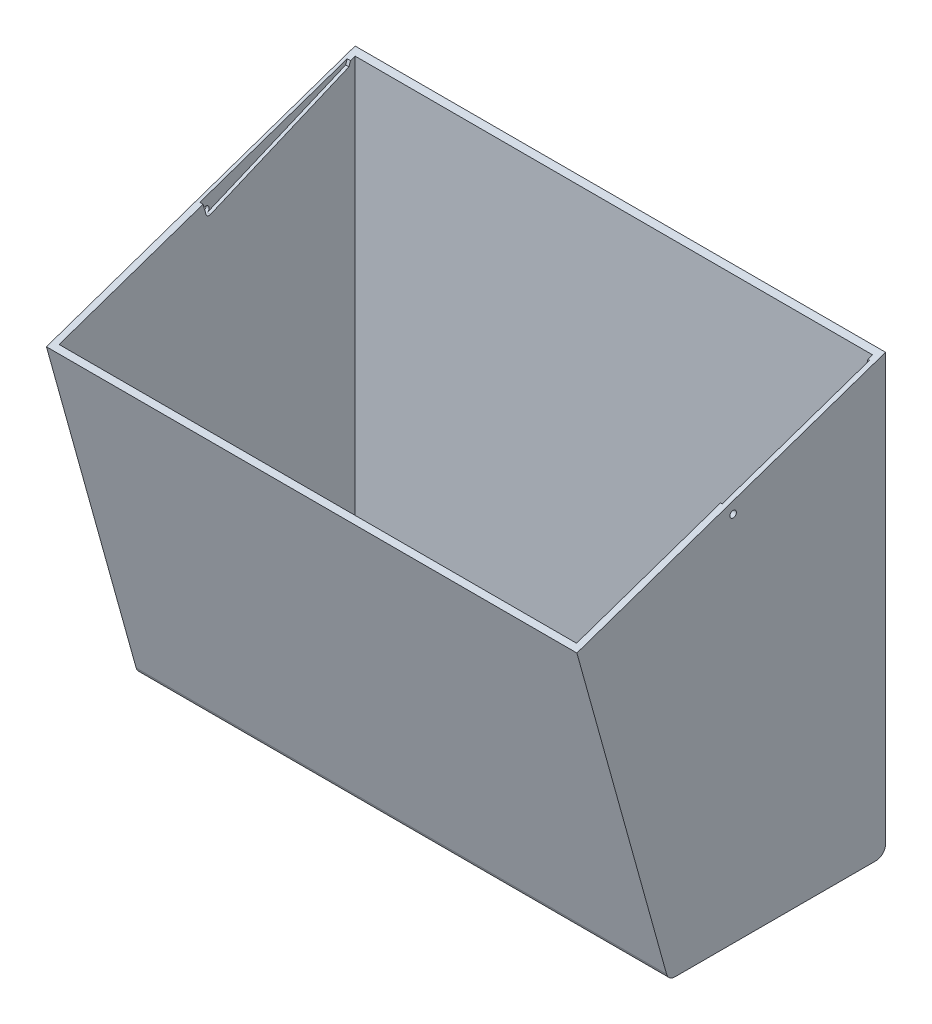
ISO-10303-21;
HEADER;
FILE_DESCRIPTION(('STEP AP214'),'2;1');
FILE_NAME('part.step','',(''),(''),'','','');
FILE_SCHEMA(('AUTOMOTIVE_DESIGN { 1 0 10303 214 1 1 1 1 }'));
ENDSEC;
DATA;
#1=APPLICATION_CONTEXT('core data for automotive mechanical design processes');
#2=APPLICATION_PROTOCOL_DEFINITION('international standard','automotive_design',2000,#1);
#3=PRODUCT_CONTEXT('',#1,'mechanical');
#4=PRODUCT('Part','Part','',(#3));
#5=PRODUCT_RELATED_PRODUCT_CATEGORY('part','',(#4));
#6=PRODUCT_DEFINITION_FORMATION('','',#4);
#7=PRODUCT_DEFINITION_CONTEXT('part definition',#1,'design');
#8=PRODUCT_DEFINITION('design','',#6,#7);
#9=PRODUCT_DEFINITION_SHAPE('','',#8);
#10=(LENGTH_UNIT() NAMED_UNIT(*) SI_UNIT(.MILLI.,.METRE.));
#11=(NAMED_UNIT(*) PLANE_ANGLE_UNIT() SI_UNIT($,.RADIAN.));
#12=(NAMED_UNIT(*) SI_UNIT($,.STERADIAN.) SOLID_ANGLE_UNIT());
#13=UNCERTAINTY_MEASURE_WITH_UNIT(LENGTH_MEASURE(1.E-05),#10,'distance_accuracy_value','');
#14=(GEOMETRIC_REPRESENTATION_CONTEXT(3) GLOBAL_UNCERTAINTY_ASSIGNED_CONTEXT((#13)) GLOBAL_UNIT_ASSIGNED_CONTEXT((#10,
#11,#12)) REPRESENTATION_CONTEXT('',''));
#15=CARTESIAN_POINT('',(0.,0.,0.));
#16=DIRECTION('',(0.,0.,1.));
#17=DIRECTION('',(1.,0.,0.));
#18=AXIS2_PLACEMENT_3D('',#15,#16,#17);
#19=CARTESIAN_POINT('',(330.,-318.691488077077,-100.9));
#20=DIRECTION('',(-1.,0.,0.));
#21=DIRECTION('',(0.,0.,1.));
#22=AXIS2_PLACEMENT_3D('',#19,#20,#21);
#23=PLANE('',#22);
#24=CARTESIAN_POINT('',(330.,-207.504674888679,-57.0650856356226));
#25=DIRECTION('',(-1.,0.,0.));
#26=DIRECTION('',(0.,0.,1.));
#27=AXIS2_PLACEMENT_3D('',#24,#25,#26);
#28=CIRCLE('',#27,0.999999999999998);
#29=CARTESIAN_POINT('',(330.,-207.504674888679,-56.0650856356226));
#30=VERTEX_POINT('',#29);
#31=EDGE_CURVE('E280',#30,#30,#28,.T.);
#32=ORIENTED_EDGE('',*,*,#31,.T.);
#33=EDGE_LOOP('',(#32));
#34=FACE_BOUND('',#33,.T.);
#35=DIRECTION('',(0.,0.325131691734762,-0.94566874910282));
#36=VECTOR('',#35,1.);
#37=CARTESIAN_POINT('',(330.,-220.434086745502,-9.04989839892832));
#38=LINE('',#37,#36);
#39=CARTESIAN_POINT('',(330.,-220.434086745502,-9.04989839892832));
#40=VERTEX_POINT('',#39);
#41=CARTESIAN_POINT('',(330.,-187.823541008395,-103.9));
#42=VERTEX_POINT('',#41);
#43=EDGE_CURVE('E349',#40,#42,#38,.T.);
#44=ORIENTED_EDGE('',*,*,#43,.F.);
#45=DIRECTION('',(0.,0.963531978673682,0.267593210065538));
#46=VECTOR('',#45,1.);
#47=CARTESIAN_POINT('',(330.,-319.713989744254,-36.6220273229737));
#48=LINE('',#47,#46);
#49=CARTESIAN_POINT('',(330.,-319.713989744254,-36.6220273229737));
#50=VERTEX_POINT('',#49);
#51=EDGE_CURVE('E388',#50,#40,#48,.T.);
#52=ORIENTED_EDGE('',*,*,#51,.F.);
#53=CARTESIAN_POINT('',(330.,-318.991488077077,-39.2235636653927));
#54=DIRECTION('',(-1.,0.,0.));
#55=DIRECTION('',(0.,0.,1.));
#56=AXIS2_PLACEMENT_3D('',#53,#54,#55);
#57=CIRCLE('',#56,2.69999999999998);
#58=CARTESIAN_POINT('',(330.,-321.691488077077,-39.2235636653926));
#59=VERTEX_POINT('',#58);
#60=EDGE_CURVE('E384',#59,#50,#57,.T.);
#61=ORIENTED_EDGE('',*,*,#60,.F.);
#62=DIRECTION('',(0.,0.,1.));
#63=VECTOR('',#62,1.);
#64=CARTESIAN_POINT('',(330.,-321.691488077077,-100.9));
#65=LINE('',#64,#63);
#66=CARTESIAN_POINT('',(330.,-321.691488077077,-100.9));
#67=VERTEX_POINT('',#66);
#68=EDGE_CURVE('E380',#67,#59,#65,.T.);
#69=ORIENTED_EDGE('',*,*,#68,.F.);
#70=CARTESIAN_POINT('',(330.,-318.691488077077,-100.9));
#71=DIRECTION('',(-1.,0.,0.));
#72=DIRECTION('',(0.,0.,1.));
#73=AXIS2_PLACEMENT_3D('',#70,#71,#72);
#74=CIRCLE('',#73,3.);
#75=CARTESIAN_POINT('',(330.,-318.691488077077,-103.9));
#76=VERTEX_POINT('',#75);
#77=EDGE_CURVE('E376',#76,#67,#74,.T.);
#78=ORIENTED_EDGE('',*,*,#77,.F.);
#79=DIRECTION('',(0.,-1.,0.));
#80=VECTOR('',#79,1.);
#81=CARTESIAN_POINT('',(330.,-187.823541008395,-103.9));
#82=LINE('',#81,#80);
#83=EDGE_CURVE('E372',#42,#76,#82,.T.);
#84=ORIENTED_EDGE('',*,*,#83,.F.);
#85=EDGE_LOOP('',(#44,#52,#61,#69,#78,#84));
#86=FACE_BOUND('',#85,.T.);
#87=ADVANCED_FACE('F39',(#34,#86),#23,.F.);
#88=CARTESIAN_POINT('',(2.43547298054586,-319.713989744254,-36.6220273229737));
#89=DIRECTION('',(0.,0.267593210065538,-0.963531978673682));
#90=DIRECTION('',(0.,0.963531978673682,0.267593210065538));
#91=AXIS2_PLACEMENT_3D('',#88,#89,#90);
#92=PLANE('',#91);
#93=DIRECTION('',(1.,0.,0.));
#94=VECTOR('',#93,1.);
#95=CARTESIAN_POINT('',(2.43547298054586,-220.434086745502,-9.04989839892832));
#96=LINE('',#95,#94);
#97=CARTESIAN_POINT('',(167.,-220.434086745502,-9.04989839892832));
#98=VERTEX_POINT('',#97);
#99=EDGE_CURVE('E392',#98,#40,#96,.T.);
#100=ORIENTED_EDGE('',*,*,#99,.F.);
#101=DIRECTION('',(0.,-0.963531978673682,-0.267593210065538));
#102=VECTOR('',#101,1.);
#103=CARTESIAN_POINT('',(167.,-319.713989744254,-36.6220273229737));
#104=LINE('',#103,#102);
#105=CARTESIAN_POINT('',(167.,-319.713989744254,-36.6220273229737));
#106=VERTEX_POINT('',#105);
#107=EDGE_CURVE('E358',#98,#106,#104,.T.);
#108=ORIENTED_EDGE('',*,*,#107,.T.);
#109=DIRECTION('',(1.,0.,0.));
#110=VECTOR('',#109,1.);
#111=CARTESIAN_POINT('',(2.43547298054586,-319.713989744254,-36.6220273229737));
#112=LINE('',#111,#110);
#113=EDGE_CURVE('E395',#106,#50,#112,.T.);
#114=ORIENTED_EDGE('',*,*,#113,.T.);
#115=ORIENTED_EDGE('',*,*,#51,.T.);
#116=EDGE_LOOP('',(#100,#108,#114,#115));
#117=FACE_BOUND('',#116,.T.);
#118=ADVANCED_FACE('F414',(#117),#92,.F.);
#119=CARTESIAN_POINT('',(2.43547298054586,-318.991488077077,-39.2235636653927));
#120=DIRECTION('',(1.,0.,0.));
#121=DIRECTION('',(0.,0.,-1.));
#122=AXIS2_PLACEMENT_3D('',#119,#120,#121);
#123=CYLINDRICAL_SURFACE('',#122,2.69999999999998);
#124=ORIENTED_EDGE('',*,*,#113,.F.);
#125=CARTESIAN_POINT('',(167.,-318.991488077077,-39.2235636653927));
#126=DIRECTION('',(1.,0.,0.));
#127=DIRECTION('',(0.,0.,-1.));
#128=AXIS2_PLACEMENT_3D('',#125,#126,#127);
#129=CIRCLE('',#128,2.69999999999998);
#130=CARTESIAN_POINT('',(167.,-321.691488077077,-39.2235636653926));
#131=VERTEX_POINT('',#130);
#132=EDGE_CURVE('E353',#106,#131,#129,.T.);
#133=ORIENTED_EDGE('',*,*,#132,.T.);
#134=DIRECTION('',(1.,0.,0.));
#135=VECTOR('',#134,1.);
#136=CARTESIAN_POINT('',(2.43547298054586,-321.691488077077,-39.2235636653926));
#137=LINE('',#136,#135);
#138=EDGE_CURVE('E398',#131,#59,#137,.T.);
#139=ORIENTED_EDGE('',*,*,#138,.T.);
#140=ORIENTED_EDGE('',*,*,#60,.T.);
#141=EDGE_LOOP('',(#124,#133,#139,#140));
#142=FACE_BOUND('',#141,.T.);
#143=ADVANCED_FACE('F434',(#142),#123,.T.);
#144=CARTESIAN_POINT('',(2.43547298054586,-321.691488077077,-100.9));
#145=DIRECTION('',(0.,1.,0.));
#146=DIRECTION('',(0.,0.,1.));
#147=AXIS2_PLACEMENT_3D('',#144,#145,#146);
#148=PLANE('',#147);
#149=ORIENTED_EDGE('',*,*,#138,.F.);
#150=DIRECTION('',(0.,0.,-1.));
#151=VECTOR('',#150,1.);
#152=CARTESIAN_POINT('',(167.,-321.691488077077,-100.9));
#153=LINE('',#152,#151);
#154=CARTESIAN_POINT('',(167.,-321.691488077077,-100.9));
#155=VERTEX_POINT('',#154);
#156=EDGE_CURVE('E357',#131,#155,#153,.T.);
#157=ORIENTED_EDGE('',*,*,#156,.T.);
#158=DIRECTION('',(1.,0.,0.));
#159=VECTOR('',#158,1.);
#160=CARTESIAN_POINT('',(2.43547298054586,-321.691488077077,-100.9));
#161=LINE('',#160,#159);
#162=EDGE_CURVE('E401',#155,#67,#161,.T.);
#163=ORIENTED_EDGE('',*,*,#162,.T.);
#164=ORIENTED_EDGE('',*,*,#68,.T.);
#165=EDGE_LOOP('',(#149,#157,#163,#164));
#166=FACE_BOUND('',#165,.T.);
#167=ADVANCED_FACE('F431',(#166),#148,.F.);
#168=CARTESIAN_POINT('',(2.43547298054586,-318.691488077077,-100.9));
#169=DIRECTION('',(1.,0.,0.));
#170=DIRECTION('',(0.,0.,-1.));
#171=AXIS2_PLACEMENT_3D('',#168,#169,#170);
#172=CYLINDRICAL_SURFACE('',#171,3.);
#173=ORIENTED_EDGE('',*,*,#162,.F.);
#174=CARTESIAN_POINT('',(167.,-318.691488077077,-100.9));
#175=DIRECTION('',(1.,0.,0.));
#176=DIRECTION('',(0.,0.,-1.));
#177=AXIS2_PLACEMENT_3D('',#174,#175,#176);
#178=CIRCLE('',#177,3.);
#179=CARTESIAN_POINT('',(167.,-318.691488077077,-103.9));
#180=VERTEX_POINT('',#179);
#181=EDGE_CURVE('E362',#155,#180,#178,.T.);
#182=ORIENTED_EDGE('',*,*,#181,.T.);
#183=DIRECTION('',(1.,0.,0.));
#184=VECTOR('',#183,1.);
#185=CARTESIAN_POINT('',(2.43547298054586,-318.691488077077,-103.9));
#186=LINE('',#185,#184);
#187=EDGE_CURVE('E404',#180,#76,#186,.T.);
#188=ORIENTED_EDGE('',*,*,#187,.T.);
#189=ORIENTED_EDGE('',*,*,#77,.T.);
#190=EDGE_LOOP('',(#173,#182,#188,#189));
#191=FACE_BOUND('',#190,.T.);
#192=ADVANCED_FACE('F427',(#191),#172,.T.);
#193=CARTESIAN_POINT('',(2.43547298054586,-187.823541008395,-103.9));
#194=DIRECTION('',(0.,0.,1.));
#195=DIRECTION('',(0.,-1.,0.));
#196=AXIS2_PLACEMENT_3D('',#193,#194,#195);
#197=PLANE('',#196);
#198=ORIENTED_EDGE('',*,*,#187,.F.);
#199=DIRECTION('',(0.,1.,0.));
#200=VECTOR('',#199,1.);
#201=CARTESIAN_POINT('',(167.,-187.823541008395,-103.9));
#202=LINE('',#201,#200);
#203=CARTESIAN_POINT('',(167.,-187.823541008395,-103.9));
#204=VERTEX_POINT('',#203);
#205=EDGE_CURVE('E49',#180,#204,#202,.T.);
#206=ORIENTED_EDGE('',*,*,#205,.T.);
#207=DIRECTION('',(1.,0.,0.));
#208=VECTOR('',#207,1.);
#209=CARTESIAN_POINT('',(2.43547298054586,-187.823541008395,-103.9));
#210=LINE('',#209,#208);
#211=EDGE_CURVE('E407',#204,#42,#210,.T.);
#212=ORIENTED_EDGE('',*,*,#211,.T.);
#213=ORIENTED_EDGE('',*,*,#83,.T.);
#214=EDGE_LOOP('',(#198,#206,#212,#213));
#215=FACE_BOUND('',#214,.T.);
#216=ADVANCED_FACE('F423',(#215),#197,.F.);
#217=CARTESIAN_POINT('',(2.43547298054586,-220.434086745502,-9.04989839892832));
#218=DIRECTION('',(0.,-0.94566874910282,-0.325131691734762));
#219=DIRECTION('',(0.,0.325131691734762,-0.94566874910282));
#220=AXIS2_PLACEMENT_3D('',#217,#218,#219);
#221=PLANE('',#220);
#222=DIRECTION('',(0.,-0.325131691734762,0.94566874910282));
#223=VECTOR('',#222,1.);
#224=CARTESIAN_POINT('',(168.,-221.575247723077,-5.73075018415457));
#225=LINE('',#224,#223);
#226=CARTESIAN_POINT('',(168.,-189.004018832004,-100.466495930189));
#227=VERTEX_POINT('',#226);
#228=CARTESIAN_POINT('',(168.,-204.576471010643,-55.1729064506055));
#229=VERTEX_POINT('',#228);
#230=EDGE_CURVE('E200',#227,#229,#225,.T.);
#231=ORIENTED_EDGE('',*,*,#230,.F.);
#232=DIRECTION('',(1.,0.,0.));
#233=VECTOR('',#232,1.);
#234=CARTESIAN_POINT('',(168.,-189.004018832004,-100.466495930189));
#235=LINE('',#234,#233);
#236=CARTESIAN_POINT('',(169.,-189.004018832004,-100.466495930189));
#237=VERTEX_POINT('',#236);
#238=EDGE_CURVE('E249',#227,#237,#235,.T.);
#239=ORIENTED_EDGE('',*,*,#238,.T.);
#240=DIRECTION('',(0.,-0.325131691734762,0.94566874910282));
#241=VECTOR('',#240,1.);
#242=CARTESIAN_POINT('',(169.,-220.434086745502,-9.04989839892832));
#243=LINE('',#242,#241);
#244=CARTESIAN_POINT('',(169.,-188.511163798179,-101.9));
#245=VERTEX_POINT('',#244);
#246=EDGE_CURVE('E345',#245,#237,#243,.T.);
#247=ORIENTED_EDGE('',*,*,#246,.F.);
#248=DIRECTION('',(1.,0.,0.));
#249=VECTOR('',#248,1.);
#250=CARTESIAN_POINT('',(2.43547298054586,-188.511163798179,-101.9));
#251=LINE('',#250,#249);
#252=CARTESIAN_POINT('',(328.,-188.511163798179,-101.9));
#253=VERTEX_POINT('',#252);
#254=EDGE_CURVE('E311',#245,#253,#251,.T.);
#255=ORIENTED_EDGE('',*,*,#254,.T.);
#256=DIRECTION('',(0.,0.325131691734762,-0.94566874910282));
#257=VECTOR('',#256,1.);
#258=CARTESIAN_POINT('',(328.,-220.434086745502,-9.04989839892832));
#259=LINE('',#258,#257);
#260=CARTESIAN_POINT('',(328.,-189.004018832004,-100.466495930189));
#261=VERTEX_POINT('',#260);
#262=EDGE_CURVE('E284',#261,#253,#259,.T.);
#263=ORIENTED_EDGE('',*,*,#262,.F.);
#264=DIRECTION('',(-1.,0.,0.));
#265=VECTOR('',#264,1.);
#266=CARTESIAN_POINT('',(328.5,-189.004018832004,-100.466495930189));
#267=LINE('',#266,#265);
#268=CARTESIAN_POINT('',(328.5,-189.004018832004,-100.466495930189));
#269=VERTEX_POINT('',#268);
#270=EDGE_CURVE('E259',#269,#261,#267,.T.);
#271=ORIENTED_EDGE('',*,*,#270,.F.);
#272=DIRECTION('',(0.,0.325131691734762,-0.94566874910282));
#273=VECTOR('',#272,1.);
#274=CARTESIAN_POINT('',(328.5,-202.580073075312,-60.9795724453656));
#275=LINE('',#274,#273);
#276=CARTESIAN_POINT('',(328.5,-204.576471010643,-55.1729064506055));
#277=VERTEX_POINT('',#276);
#278=EDGE_CURVE('E238',#277,#269,#275,.T.);
#279=ORIENTED_EDGE('',*,*,#278,.F.);
#280=DIRECTION('',(-1.,0.,0.));
#281=VECTOR('',#280,1.);
#282=CARTESIAN_POINT('',(328.5,-204.576471010643,-55.1729064506055));
#283=LINE('',#282,#281);
#284=CARTESIAN_POINT('',(328.,-204.576471010643,-55.1729064506055));
#285=VERTEX_POINT('',#284);
#286=EDGE_CURVE('E262',#277,#285,#283,.T.);
#287=ORIENTED_EDGE('',*,*,#286,.T.);
#288=CARTESIAN_POINT('',(328.,-219.782641062434,-10.9446746999676));
#289=VERTEX_POINT('',#288);
#290=EDGE_CURVE('E305',#289,#285,#259,.T.);
#291=ORIENTED_EDGE('',*,*,#290,.F.);
#292=DIRECTION('',(1.,0.,0.));
#293=VECTOR('',#292,1.);
#294=CARTESIAN_POINT('',(2.43547298054586,-219.782641062434,-10.9446746999676));
#295=LINE('',#294,#293);
#296=CARTESIAN_POINT('',(169.,-219.782641062434,-10.9446746999676));
#297=VERTEX_POINT('',#296);
#298=EDGE_CURVE('E288',#297,#289,#295,.T.);
#299=ORIENTED_EDGE('',*,*,#298,.F.);
#300=CARTESIAN_POINT('',(169.,-204.576471010643,-55.1729064506055));
#301=VERTEX_POINT('',#300);
#302=EDGE_CURVE('E216',#301,#297,#243,.T.);
#303=ORIENTED_EDGE('',*,*,#302,.F.);
#304=DIRECTION('',(1.,0.,0.));
#305=VECTOR('',#304,1.);
#306=CARTESIAN_POINT('',(168.,-204.576471010643,-55.1729064506055));
#307=LINE('',#306,#305);
#308=EDGE_CURVE('E193',#229,#301,#307,.T.);
#309=ORIENTED_EDGE('',*,*,#308,.F.);
#310=EDGE_LOOP('',(#231,#239,#247,#255,#263,#271,#279,#287,#291,#299,#303,#309));
#311=FACE_BOUND('',#310,.T.);
#312=ORIENTED_EDGE('',*,*,#211,.F.);
#313=DIRECTION('',(0.,-0.325131691734762,0.94566874910282));
#314=VECTOR('',#313,1.);
#315=CARTESIAN_POINT('',(167.,-220.434086745502,-9.04989839892832));
#316=LINE('',#315,#314);
#317=EDGE_CURVE('E11',#204,#98,#316,.T.);
#318=ORIENTED_EDGE('',*,*,#317,.T.);
#319=ORIENTED_EDGE('',*,*,#99,.T.);
#320=ORIENTED_EDGE('',*,*,#43,.T.);
#321=EDGE_LOOP('',(#312,#318,#319,#320));
#322=FACE_BOUND('',#321,.T.);
#323=ADVANCED_FACE('F41',(#311,#322),#221,.F.);
#324=CARTESIAN_POINT('',(167.,-318.991488077077,-39.2235636653927));
#325=DIRECTION('',(1.,0.,0.));
#326=DIRECTION('',(0.,0.,-1.));
#327=AXIS2_PLACEMENT_3D('',#324,#325,#326);
#328=PLANE('',#327);
#329=CARTESIAN_POINT('',(167.,-207.504674888679,-57.0650856356226));
#330=DIRECTION('',(1.,0.,0.));
#331=DIRECTION('',(0.,0.,-1.));
#332=AXIS2_PLACEMENT_3D('',#329,#330,#331);
#333=CIRCLE('',#332,0.999999999999998);
#334=CARTESIAN_POINT('',(167.,-207.504674888679,-58.0650856356226));
#335=VERTEX_POINT('',#334);
#336=EDGE_CURVE('E276',#335,#335,#333,.T.);
#337=ORIENTED_EDGE('',*,*,#336,.T.);
#338=EDGE_LOOP('',(#337));
#339=FACE_BOUND('',#338,.T.);
#340=ORIENTED_EDGE('',*,*,#205,.F.);
#341=ORIENTED_EDGE('',*,*,#181,.F.);
#342=ORIENTED_EDGE('',*,*,#156,.F.);
#343=ORIENTED_EDGE('',*,*,#132,.F.);
#344=ORIENTED_EDGE('',*,*,#107,.F.);
#345=ORIENTED_EDGE('',*,*,#317,.F.);
#346=EDGE_LOOP('',(#340,#341,#342,#343,#344,#345));
#347=FACE_BOUND('',#346,.T.);
#348=ADVANCED_FACE('F417',(#339,#347),#328,.F.);
#349=CARTESIAN_POINT('',(328.,-318.691488077077,-100.9));
#350=DIRECTION('',(-1.,0.,0.));
#351=DIRECTION('',(0.,0.,1.));
#352=AXIS2_PLACEMENT_3D('',#349,#350,#351);
#353=PLANE('',#352);
#354=DIRECTION('',(0.,-0.389635019508092,0.92096935430715));
#355=VECTOR('',#354,1.);
#356=CARTESIAN_POINT('',(328.,-209.575715648945,-54.736329167912));
#357=LINE('',#356,#355);
#358=CARTESIAN_POINT('',(328.,-190.428039803798,-99.995152879013));
#359=VERTEX_POINT('',#358);
#360=CARTESIAN_POINT('',(328.,-208.425644242986,-57.4547206551307));
#361=VERTEX_POINT('',#360);
#362=EDGE_CURVE('E245',#359,#361,#357,.T.);
#363=ORIENTED_EDGE('',*,*,#362,.F.);
#364=DIRECTION('',(0.,-0.949347314529134,0.314228700783875));
#365=VECTOR('',#364,1.);
#366=CARTESIAN_POINT('',(328.,-305.756869789988,-61.8219491896344));
#367=LINE('',#366,#365);
#368=EDGE_CURVE('E231',#261,#359,#367,.T.);
#369=ORIENTED_EDGE('',*,*,#368,.F.);
#370=ORIENTED_EDGE('',*,*,#262,.T.);
#371=DIRECTION('',(0.,-1.,0.));
#372=VECTOR('',#371,1.);
#373=CARTESIAN_POINT('',(328.,-187.823541008395,-101.9));
#374=LINE('',#373,#372);
#375=CARTESIAN_POINT('',(328.,-318.691488077077,-101.9));
#376=VERTEX_POINT('',#375);
#377=EDGE_CURVE('E301',#253,#376,#374,.T.);
#378=ORIENTED_EDGE('',*,*,#377,.T.);
#379=CARTESIAN_POINT('',(328.,-318.691488077077,-100.9));
#380=DIRECTION('',(-1.,0.,0.));
#381=DIRECTION('',(0.,0.,1.));
#382=AXIS2_PLACEMENT_3D('',#379,#380,#381);
#383=CIRCLE('',#382,1.);
#384=CARTESIAN_POINT('',(328.,-319.691488077077,-100.9));
#385=VERTEX_POINT('',#384);
#386=EDGE_CURVE('E297',#376,#385,#383,.T.);
#387=ORIENTED_EDGE('',*,*,#386,.T.);
#388=DIRECTION('',(0.,0.,1.));
#389=VECTOR('',#388,1.);
#390=CARTESIAN_POINT('',(328.,-319.691488077077,-100.9));
#391=LINE('',#390,#389);
#392=CARTESIAN_POINT('',(328.,-319.691488077077,-39.2235636653927));
#393=VERTEX_POINT('',#392);
#394=EDGE_CURVE('E293',#385,#393,#391,.T.);
#395=ORIENTED_EDGE('',*,*,#394,.T.);
#396=CARTESIAN_POINT('',(328.,-318.991488077077,-39.2235636653927));
#397=DIRECTION('',(-1.,0.,0.));
#398=DIRECTION('',(0.,0.,1.));
#399=AXIS2_PLACEMENT_3D('',#396,#397,#398);
#400=CIRCLE('',#399,0.699999999999981);
#401=CARTESIAN_POINT('',(328.,-319.178803324123,-38.5490912803211));
#402=VERTEX_POINT('',#401);
#403=EDGE_CURVE('E289',#393,#402,#400,.T.);
#404=ORIENTED_EDGE('',*,*,#403,.T.);
#405=DIRECTION('',(0.,0.963531978673682,0.267593210065538));
#406=VECTOR('',#405,1.);
#407=CARTESIAN_POINT('',(328.,-319.178803324123,-38.5490912803211));
#408=LINE('',#407,#406);
#409=EDGE_CURVE('E285',#402,#289,#408,.T.);
#410=ORIENTED_EDGE('',*,*,#409,.T.);
#411=ORIENTED_EDGE('',*,*,#290,.T.);
#412=DIRECTION('',(0.,-0.96028492375255,-0.279021263013341));
#413=VECTOR('',#412,1.);
#414=CARTESIAN_POINT('',(328.,-322.059420468919,-89.3088593637095));
#415=LINE('',#414,#413);
#416=CARTESIAN_POINT('',(328.,-207.783696151692,-56.10480071187));
#417=VERTEX_POINT('',#416);
#418=EDGE_CURVE('E248',#285,#417,#415,.T.);
#419=ORIENTED_EDGE('',*,*,#418,.T.);
#420=CARTESIAN_POINT('',(328.,-207.504674888679,-57.0650856356226));
#421=DIRECTION('',(-1.,0.,0.));
#422=DIRECTION('',(0.,0.,1.));
#423=AXIS2_PLACEMENT_3D('',#420,#421,#422);
#424=CIRCLE('',#423,0.999999999999998);
#425=EDGE_CURVE('E272',#361,#417,#424,.T.);
#426=ORIENTED_EDGE('',*,*,#425,.F.);
#427=EDGE_LOOP('',(#363,#369,#370,#378,#387,#395,#404,#410,#411,#419,#426));
#428=FACE_BOUND('',#427,.T.);
#429=ADVANCED_FACE('F459',(#428),#353,.T.);
#430=CARTESIAN_POINT('',(2.43547298054586,-319.178803324123,-38.5490912803211));
#431=DIRECTION('',(0.,0.267593210065538,-0.963531978673682));
#432=DIRECTION('',(0.,0.963531978673682,0.267593210065538));
#433=AXIS2_PLACEMENT_3D('',#430,#431,#432);
#434=PLANE('',#433);
#435=ORIENTED_EDGE('',*,*,#298,.T.);
#436=ORIENTED_EDGE('',*,*,#409,.F.);
#437=DIRECTION('',(1.,0.,0.));
#438=VECTOR('',#437,1.);
#439=CARTESIAN_POINT('',(2.43547298054586,-319.178803324123,-38.5490912803211));
#440=LINE('',#439,#438);
#441=CARTESIAN_POINT('',(169.,-319.178803324123,-38.5490912803211));
#442=VERTEX_POINT('',#441);
#443=EDGE_CURVE('E312',#442,#402,#440,.T.);
#444=ORIENTED_EDGE('',*,*,#443,.F.);
#445=DIRECTION('',(0.,-0.963531978673682,-0.267593210065538));
#446=VECTOR('',#445,1.);
#447=CARTESIAN_POINT('',(169.,-319.178803324123,-38.5490912803211));
#448=LINE('',#447,#446);
#449=EDGE_CURVE('E306',#297,#442,#448,.T.);
#450=ORIENTED_EDGE('',*,*,#449,.F.);
#451=EDGE_LOOP('',(#435,#436,#444,#450));
#452=FACE_BOUND('',#451,.T.);
#453=ADVANCED_FACE('F464',(#452),#434,.T.);
#454=CARTESIAN_POINT('',(2.43547298054586,-318.991488077077,-39.2235636653927));
#455=DIRECTION('',(1.,0.,0.));
#456=DIRECTION('',(0.,0.,-1.));
#457=AXIS2_PLACEMENT_3D('',#454,#455,#456);
#458=CYLINDRICAL_SURFACE('',#457,0.699999999999981);
#459=ORIENTED_EDGE('',*,*,#443,.T.);
#460=ORIENTED_EDGE('',*,*,#403,.F.);
#461=DIRECTION('',(1.,0.,0.));
#462=VECTOR('',#461,1.);
#463=CARTESIAN_POINT('',(2.43547298054586,-319.691488077077,-39.2235636653927));
#464=LINE('',#463,#462);
#465=CARTESIAN_POINT('',(169.,-319.691488077077,-39.2235636653927));
#466=VERTEX_POINT('',#465);
#467=EDGE_CURVE('E315',#466,#393,#464,.T.);
#468=ORIENTED_EDGE('',*,*,#467,.F.);
#469=CARTESIAN_POINT('',(169.,-318.991488077077,-39.2235636653927));
#470=DIRECTION('',(1.,0.,0.));
#471=DIRECTION('',(0.,0.,-1.));
#472=AXIS2_PLACEMENT_3D('',#469,#470,#471);
#473=CIRCLE('',#472,0.699999999999981);
#474=EDGE_CURVE('E310',#442,#466,#473,.T.);
#475=ORIENTED_EDGE('',*,*,#474,.F.);
#476=EDGE_LOOP('',(#459,#460,#468,#475));
#477=FACE_BOUND('',#476,.T.);
#478=ADVANCED_FACE('F489',(#477),#458,.F.);
#479=CARTESIAN_POINT('',(2.43547298054586,-319.691488077077,-100.9));
#480=DIRECTION('',(0.,1.,0.));
#481=DIRECTION('',(0.,0.,1.));
#482=AXIS2_PLACEMENT_3D('',#479,#480,#481);
#483=PLANE('',#482);
#484=ORIENTED_EDGE('',*,*,#467,.T.);
#485=ORIENTED_EDGE('',*,*,#394,.F.);
#486=DIRECTION('',(1.,0.,0.));
#487=VECTOR('',#486,1.);
#488=CARTESIAN_POINT('',(2.43547298054586,-319.691488077077,-100.9));
#489=LINE('',#488,#487);
#490=CARTESIAN_POINT('',(169.,-319.691488077077,-100.9));
#491=VERTEX_POINT('',#490);
#492=EDGE_CURVE('E322',#491,#385,#489,.T.);
#493=ORIENTED_EDGE('',*,*,#492,.F.);
#494=DIRECTION('',(0.,0.,-1.));
#495=VECTOR('',#494,1.);
#496=CARTESIAN_POINT('',(169.,-319.691488077077,-100.9));
#497=LINE('',#496,#495);
#498=EDGE_CURVE('E319',#466,#491,#497,.T.);
#499=ORIENTED_EDGE('',*,*,#498,.F.);
#500=EDGE_LOOP('',(#484,#485,#493,#499));
#501=FACE_BOUND('',#500,.T.);
#502=ADVANCED_FACE('F493',(#501),#483,.T.);
#503=CARTESIAN_POINT('',(2.43547298054586,-318.691488077077,-100.9));
#504=DIRECTION('',(1.,0.,0.));
#505=DIRECTION('',(0.,0.,-1.));
#506=AXIS2_PLACEMENT_3D('',#503,#504,#505);
#507=CYLINDRICAL_SURFACE('',#506,1.);
#508=ORIENTED_EDGE('',*,*,#492,.T.);
#509=ORIENTED_EDGE('',*,*,#386,.F.);
#510=DIRECTION('',(1.,0.,0.));
#511=VECTOR('',#510,1.);
#512=CARTESIAN_POINT('',(2.43547298054586,-318.691488077077,-101.9));
#513=LINE('',#512,#511);
#514=CARTESIAN_POINT('',(169.,-318.691488077077,-101.9));
#515=VERTEX_POINT('',#514);
#516=EDGE_CURVE('E329',#515,#376,#513,.T.);
#517=ORIENTED_EDGE('',*,*,#516,.F.);
#518=CARTESIAN_POINT('',(169.,-318.691488077077,-100.9));
#519=DIRECTION('',(1.,0.,0.));
#520=DIRECTION('',(0.,0.,-1.));
#521=AXIS2_PLACEMENT_3D('',#518,#519,#520);
#522=CIRCLE('',#521,1.);
#523=EDGE_CURVE('E326',#491,#515,#522,.T.);
#524=ORIENTED_EDGE('',*,*,#523,.F.);
#525=EDGE_LOOP('',(#508,#509,#517,#524));
#526=FACE_BOUND('',#525,.T.);
#527=ADVANCED_FACE('F497',(#526),#507,.F.);
#528=CARTESIAN_POINT('',(2.43547298054586,-187.823541008395,-101.9));
#529=DIRECTION('',(0.,0.,1.));
#530=DIRECTION('',(0.,-1.,0.));
#531=AXIS2_PLACEMENT_3D('',#528,#529,#530);
#532=PLANE('',#531);
#533=ORIENTED_EDGE('',*,*,#516,.T.);
#534=ORIENTED_EDGE('',*,*,#377,.F.);
#535=ORIENTED_EDGE('',*,*,#254,.F.);
#536=DIRECTION('',(0.,1.,0.));
#537=VECTOR('',#536,1.);
#538=CARTESIAN_POINT('',(169.,-187.823541008395,-101.9));
#539=LINE('',#538,#537);
#540=EDGE_CURVE('E333',#515,#245,#539,.T.);
#541=ORIENTED_EDGE('',*,*,#540,.F.);
#542=EDGE_LOOP('',(#533,#534,#535,#541));
#543=FACE_BOUND('',#542,.T.);
#544=ADVANCED_FACE('F481',(#543),#532,.T.);
#545=CARTESIAN_POINT('',(169.,-318.991488077077,-39.2235636653927));
#546=DIRECTION('',(1.,0.,0.));
#547=DIRECTION('',(0.,0.,-1.));
#548=AXIS2_PLACEMENT_3D('',#545,#546,#547);
#549=PLANE('',#548);
#550=DIRECTION('',(0.,0.949347314529134,-0.314228700783875));
#551=VECTOR('',#550,1.);
#552=CARTESIAN_POINT('',(169.,-324.426079647569,-55.6425441727058));
#553=LINE('',#552,#551);
#554=CARTESIAN_POINT('',(169.,-190.428039803798,-99.995152879013));
#555=VERTEX_POINT('',#554);
#556=EDGE_CURVE('E211',#555,#237,#553,.T.);
#557=ORIENTED_EDGE('',*,*,#556,.F.);
#558=DIRECTION('',(0.,0.389635019508093,-0.92096935430715));
#559=VECTOR('',#558,1.);
#560=CARTESIAN_POINT('',(169.,-231.753350643596,-2.31567609912722));
#561=LINE('',#560,#559);
#562=CARTESIAN_POINT('',(169.,-208.425644242986,-57.4547206551307));
#563=VERTEX_POINT('',#562);
#564=EDGE_CURVE('E574',#563,#555,#561,.T.);
#565=ORIENTED_EDGE('',*,*,#564,.F.);
#566=CARTESIAN_POINT('',(169.,-207.504674888679,-57.0650856356226));
#567=DIRECTION('',(1.,0.,0.));
#568=DIRECTION('',(0.,0.,-1.));
#569=AXIS2_PLACEMENT_3D('',#566,#567,#568);
#570=CIRCLE('',#569,0.999999999999998);
#571=CARTESIAN_POINT('',(169.,-207.783696151692,-56.1048007118701));
#572=VERTEX_POINT('',#571);
#573=EDGE_CURVE('E43',#572,#563,#570,.T.);
#574=ORIENTED_EDGE('',*,*,#573,.F.);
#575=DIRECTION('',(0.,0.96028492375255,0.279021263013341));
#576=VECTOR('',#575,1.);
#577=CARTESIAN_POINT('',(169.,-305.810485668234,-84.5875540525821));
#578=LINE('',#577,#576);
#579=EDGE_CURVE('E577',#572,#301,#578,.T.);
#580=ORIENTED_EDGE('',*,*,#579,.T.);
#581=ORIENTED_EDGE('',*,*,#302,.T.);
#582=ORIENTED_EDGE('',*,*,#449,.T.);
#583=ORIENTED_EDGE('',*,*,#474,.T.);
#584=ORIENTED_EDGE('',*,*,#498,.T.);
#585=ORIENTED_EDGE('',*,*,#523,.T.);
#586=ORIENTED_EDGE('',*,*,#540,.T.);
#587=ORIENTED_EDGE('',*,*,#246,.T.);
#588=EDGE_LOOP('',(#557,#565,#574,#580,#581,#582,#583,#584,#585,#586,#587));
#589=FACE_BOUND('',#588,.T.);
#590=ADVANCED_FACE('F472',(#589),#549,.T.);
#591=CARTESIAN_POINT('',(-32.0005,-207.504674888679,-57.0650856356226));
#592=DIRECTION('',(1.,0.,0.));
#593=DIRECTION('',(0.,0.,-1.));
#594=AXIS2_PLACEMENT_3D('',#591,#592,#593);
#595=CYLINDRICAL_SURFACE('',#594,0.999999999999998);
#596=ORIENTED_EDGE('',*,*,#573,.T.);
#597=DIRECTION('',(1.,0.,0.));
#598=VECTOR('',#597,1.);
#599=CARTESIAN_POINT('',(168.,-208.425644242986,-57.4547206551307));
#600=LINE('',#599,#598);
#601=CARTESIAN_POINT('',(168.,-208.425644242986,-57.4547206551307));
#602=VERTEX_POINT('',#601);
#603=EDGE_CURVE('E222',#602,#563,#600,.T.);
#604=ORIENTED_EDGE('',*,*,#603,.F.);
#605=CARTESIAN_POINT('',(168.,-207.504674888679,-57.0650856356226));
#606=DIRECTION('',(1.,0.,0.));
#607=DIRECTION('',(0.,0.,-1.));
#608=AXIS2_PLACEMENT_3D('',#605,#606,#607);
#609=CIRCLE('',#608,0.999999999999998);
#610=CARTESIAN_POINT('',(168.,-207.783696151692,-56.1048007118701));
#611=VERTEX_POINT('',#610);
#612=EDGE_CURVE('E199',#602,#611,#609,.T.);
#613=ORIENTED_EDGE('',*,*,#612,.T.);
#614=DIRECTION('',(1.,0.,0.));
#615=VECTOR('',#614,1.);
#616=CARTESIAN_POINT('',(168.,-207.783696151692,-56.1048007118701));
#617=LINE('',#616,#615);
#618=EDGE_CURVE('E196',#611,#572,#617,.T.);
#619=ORIENTED_EDGE('',*,*,#618,.T.);
#620=EDGE_LOOP('',(#596,#604,#613,#619));
#621=FACE_BOUND('',#620,.T.);
#622=ORIENTED_EDGE('',*,*,#336,.F.);
#623=EDGE_LOOP('',(#622));
#624=FACE_BOUND('',#623,.T.);
#625=ADVANCED_FACE('F469',(#621,#624),#595,.F.);
#626=CARTESIAN_POINT('',(328.5,-207.504674888679,-57.0650856356226));
#627=DIRECTION('',(-1.,0.,0.));
#628=DIRECTION('',(0.,0.,1.));
#629=AXIS2_PLACEMENT_3D('',#626,#627,#628);
#630=CIRCLE('',#629,0.999999999999998);
#631=CARTESIAN_POINT('',(328.5,-207.783696151692,-56.10480071187));
#632=VERTEX_POINT('',#631);
#633=CARTESIAN_POINT('',(328.5,-208.425644242986,-57.4547206551307));
#634=VERTEX_POINT('',#633);
#635=EDGE_CURVE('E230',#632,#634,#630,.T.);
#636=ORIENTED_EDGE('',*,*,#635,.T.);
#637=DIRECTION('',(-1.,0.,0.));
#638=VECTOR('',#637,1.);
#639=CARTESIAN_POINT('',(328.5,-208.425644242986,-57.4547206551307));
#640=LINE('',#639,#638);
#641=EDGE_CURVE('E244',#634,#361,#640,.T.);
#642=ORIENTED_EDGE('',*,*,#641,.T.);
#643=ORIENTED_EDGE('',*,*,#425,.T.);
#644=DIRECTION('',(-1.,0.,0.));
#645=VECTOR('',#644,1.);
#646=CARTESIAN_POINT('',(328.5,-207.783696151692,-56.10480071187));
#647=LINE('',#646,#645);
#648=EDGE_CURVE('E266',#632,#417,#647,.T.);
#649=ORIENTED_EDGE('',*,*,#648,.F.);
#650=EDGE_LOOP('',(#636,#642,#643,#649));
#651=FACE_BOUND('',#650,.T.);
#652=ORIENTED_EDGE('',*,*,#31,.F.);
#653=EDGE_LOOP('',(#652));
#654=FACE_BOUND('',#653,.T.);
#655=ADVANCED_FACE('F471',(#651,#654),#595,.F.);
#656=CARTESIAN_POINT('',(328.5,-209.575715648945,-54.736329167912));
#657=DIRECTION('',(0.,-0.92096935430715,-0.389635019508092));
#658=DIRECTION('',(0.,0.389635019508092,-0.92096935430715));
#659=AXIS2_PLACEMENT_3D('',#656,#657,#658);
#660=PLANE('',#659);
#661=ORIENTED_EDGE('',*,*,#362,.T.);
#662=ORIENTED_EDGE('',*,*,#641,.F.);
#663=DIRECTION('',(0.,-0.389635019508092,0.92096935430715));
#664=VECTOR('',#663,1.);
#665=CARTESIAN_POINT('',(328.5,-209.575715648945,-54.736329167912));
#666=LINE('',#665,#664);
#667=CARTESIAN_POINT('',(328.5,-190.428039803798,-99.995152879013));
#668=VERTEX_POINT('',#667);
#669=EDGE_CURVE('E65',#668,#634,#666,.T.);
#670=ORIENTED_EDGE('',*,*,#669,.F.);
#671=DIRECTION('',(-1.,0.,0.));
#672=VECTOR('',#671,1.);
#673=CARTESIAN_POINT('',(328.5,-190.428039803798,-99.995152879013));
#674=LINE('',#673,#672);
#675=EDGE_CURVE('E256',#668,#359,#674,.T.);
#676=ORIENTED_EDGE('',*,*,#675,.T.);
#677=EDGE_LOOP('',(#661,#662,#670,#676));
#678=FACE_BOUND('',#677,.T.);
#679=ADVANCED_FACE('F479',(#678),#660,.F.);
#680=CARTESIAN_POINT('',(328.5,-305.756869789988,-61.8219491896344));
#681=DIRECTION('',(0.,-0.314228700783875,-0.949347314529134));
#682=DIRECTION('',(0.,0.949347314529134,-0.314228700783875));
#683=AXIS2_PLACEMENT_3D('',#680,#681,#682);
#684=PLANE('',#683);
#685=ORIENTED_EDGE('',*,*,#368,.T.);
#686=ORIENTED_EDGE('',*,*,#675,.F.);
#687=DIRECTION('',(0.,-0.949347314529134,0.314228700783875));
#688=VECTOR('',#687,1.);
#689=CARTESIAN_POINT('',(328.5,-305.756869789988,-61.8219491896344));
#690=LINE('',#689,#688);
#691=EDGE_CURVE('E241',#269,#668,#690,.T.);
#692=ORIENTED_EDGE('',*,*,#691,.F.);
#693=ORIENTED_EDGE('',*,*,#270,.T.);
#694=EDGE_LOOP('',(#685,#686,#692,#693));
#695=FACE_BOUND('',#694,.T.);
#696=ADVANCED_FACE('F533',(#695),#684,.F.);
#697=CARTESIAN_POINT('',(328.5,-322.059420468919,-89.3088593637095));
#698=DIRECTION('',(0.,0.279021263013341,-0.960284923752549));
#699=DIRECTION('',(0.,0.96028492375255,0.279021263013341));
#700=AXIS2_PLACEMENT_3D('',#697,#698,#699);
#701=PLANE('',#700);
#702=ORIENTED_EDGE('',*,*,#418,.F.);
#703=ORIENTED_EDGE('',*,*,#286,.F.);
#704=DIRECTION('',(0.,-0.96028492375255,-0.279021263013341));
#705=VECTOR('',#704,1.);
#706=CARTESIAN_POINT('',(328.5,-322.059420468919,-89.3088593637095));
#707=LINE('',#706,#705);
#708=EDGE_CURVE('E235',#277,#632,#707,.T.);
#709=ORIENTED_EDGE('',*,*,#708,.T.);
#710=ORIENTED_EDGE('',*,*,#648,.T.);
#711=EDGE_LOOP('',(#702,#703,#709,#710));
#712=FACE_BOUND('',#711,.T.);
#713=ADVANCED_FACE('F526',(#712),#701,.T.);
#714=CARTESIAN_POINT('',(328.5,-207.504674888679,-57.0650856356226));
#715=DIRECTION('',(-1.,0.,0.));
#716=DIRECTION('',(0.,0.,1.));
#717=AXIS2_PLACEMENT_3D('',#714,#715,#716);
#718=PLANE('',#717);
#719=ORIENTED_EDGE('',*,*,#669,.T.);
#720=ORIENTED_EDGE('',*,*,#635,.F.);
#721=ORIENTED_EDGE('',*,*,#708,.F.);
#722=ORIENTED_EDGE('',*,*,#278,.T.);
#723=ORIENTED_EDGE('',*,*,#691,.T.);
#724=EDGE_LOOP('',(#719,#720,#721,#722,#723));
#725=FACE_BOUND('',#724,.T.);
#726=ADVANCED_FACE('F527',(#725),#718,.T.);
#727=CARTESIAN_POINT('',(168.,-324.426079647569,-55.6425441727058));
#728=DIRECTION('',(0.,-0.314228700783875,-0.949347314529134));
#729=DIRECTION('',(0.,0.949347314529134,-0.314228700783875));
#730=AXIS2_PLACEMENT_3D('',#727,#728,#729);
#731=PLANE('',#730);
#732=ORIENTED_EDGE('',*,*,#556,.T.);
#733=ORIENTED_EDGE('',*,*,#238,.F.);
#734=DIRECTION('',(0.,0.949347314529134,-0.314228700783875));
#735=VECTOR('',#734,1.);
#736=CARTESIAN_POINT('',(168.,-324.426079647569,-55.6425441727058));
#737=LINE('',#736,#735);
#738=CARTESIAN_POINT('',(168.,-190.428039803798,-99.995152879013));
#739=VERTEX_POINT('',#738);
#740=EDGE_CURVE('E207',#739,#227,#737,.T.);
#741=ORIENTED_EDGE('',*,*,#740,.F.);
#742=DIRECTION('',(1.,0.,0.));
#743=VECTOR('',#742,1.);
#744=CARTESIAN_POINT('',(168.,-190.428039803798,-99.995152879013));
#745=LINE('',#744,#743);
#746=EDGE_CURVE('E559',#739,#555,#745,.T.);
#747=ORIENTED_EDGE('',*,*,#746,.T.);
#748=EDGE_LOOP('',(#732,#733,#741,#747));
#749=FACE_BOUND('',#748,.T.);
#750=ADVANCED_FACE('F587',(#749),#731,.F.);
#751=CARTESIAN_POINT('',(168.,-231.753350643596,-2.31567609912722));
#752=DIRECTION('',(0.,-0.92096935430715,-0.389635019508093));
#753=DIRECTION('',(0.,0.389635019508093,-0.92096935430715));
#754=AXIS2_PLACEMENT_3D('',#751,#752,#753);
#755=PLANE('',#754);
#756=ORIENTED_EDGE('',*,*,#564,.T.);
#757=ORIENTED_EDGE('',*,*,#746,.F.);
#758=DIRECTION('',(0.,0.389635019508093,-0.92096935430715));
#759=VECTOR('',#758,1.);
#760=CARTESIAN_POINT('',(168.,-231.753350643596,-2.31567609912722));
#761=LINE('',#760,#759);
#762=EDGE_CURVE('E224',#602,#739,#761,.T.);
#763=ORIENTED_EDGE('',*,*,#762,.F.);
#764=ORIENTED_EDGE('',*,*,#603,.T.);
#765=EDGE_LOOP('',(#756,#757,#763,#764));
#766=FACE_BOUND('',#765,.T.);
#767=ADVANCED_FACE('F585',(#766),#755,.F.);
#768=CARTESIAN_POINT('',(168.,-305.810485668234,-84.5875540525821));
#769=DIRECTION('',(0.,0.279021263013341,-0.960284923752549));
#770=DIRECTION('',(0.,0.96028492375255,0.279021263013341));
#771=AXIS2_PLACEMENT_3D('',#768,#769,#770);
#772=PLANE('',#771);
#773=ORIENTED_EDGE('',*,*,#579,.F.);
#774=ORIENTED_EDGE('',*,*,#618,.F.);
#775=DIRECTION('',(0.,0.96028492375255,0.279021263013341));
#776=VECTOR('',#775,1.);
#777=CARTESIAN_POINT('',(168.,-305.810485668234,-84.5875540525821));
#778=LINE('',#777,#776);
#779=EDGE_CURVE('E57',#611,#229,#778,.T.);
#780=ORIENTED_EDGE('',*,*,#779,.T.);
#781=ORIENTED_EDGE('',*,*,#308,.T.);
#782=EDGE_LOOP('',(#773,#774,#780,#781));
#783=FACE_BOUND('',#782,.T.);
#784=ADVANCED_FACE('F191',(#783),#772,.T.);
#785=CARTESIAN_POINT('',(168.,-207.504674888679,-57.0650856356226));
#786=DIRECTION('',(1.,0.,0.));
#787=DIRECTION('',(0.,0.,-1.));
#788=AXIS2_PLACEMENT_3D('',#785,#786,#787);
#789=PLANE('',#788);
#790=ORIENTED_EDGE('',*,*,#230,.T.);
#791=ORIENTED_EDGE('',*,*,#779,.F.);
#792=ORIENTED_EDGE('',*,*,#612,.F.);
#793=ORIENTED_EDGE('',*,*,#762,.T.);
#794=ORIENTED_EDGE('',*,*,#740,.T.);
#795=EDGE_LOOP('',(#790,#791,#792,#793,#794));
#796=FACE_BOUND('',#795,.T.);
#797=ADVANCED_FACE('F204',(#796),#789,.T.);
#798=CLOSED_SHELL('',(#87,#118,#143,#167,#192,#216,#323,#348,#429,#453,#478,#502,#527,#544,#590,
#625,#655,#679,#696,#713,#726,#750,#767,#784,#797));
#799=MANIFOLD_SOLID_BREP('B2',#798);
#800=ADVANCED_BREP_SHAPE_REPRESENTATION('',(#18,#799),#14);
#801=SHAPE_DEFINITION_REPRESENTATION(#9,#800);
ENDSEC;
END-ISO-10303-21;
